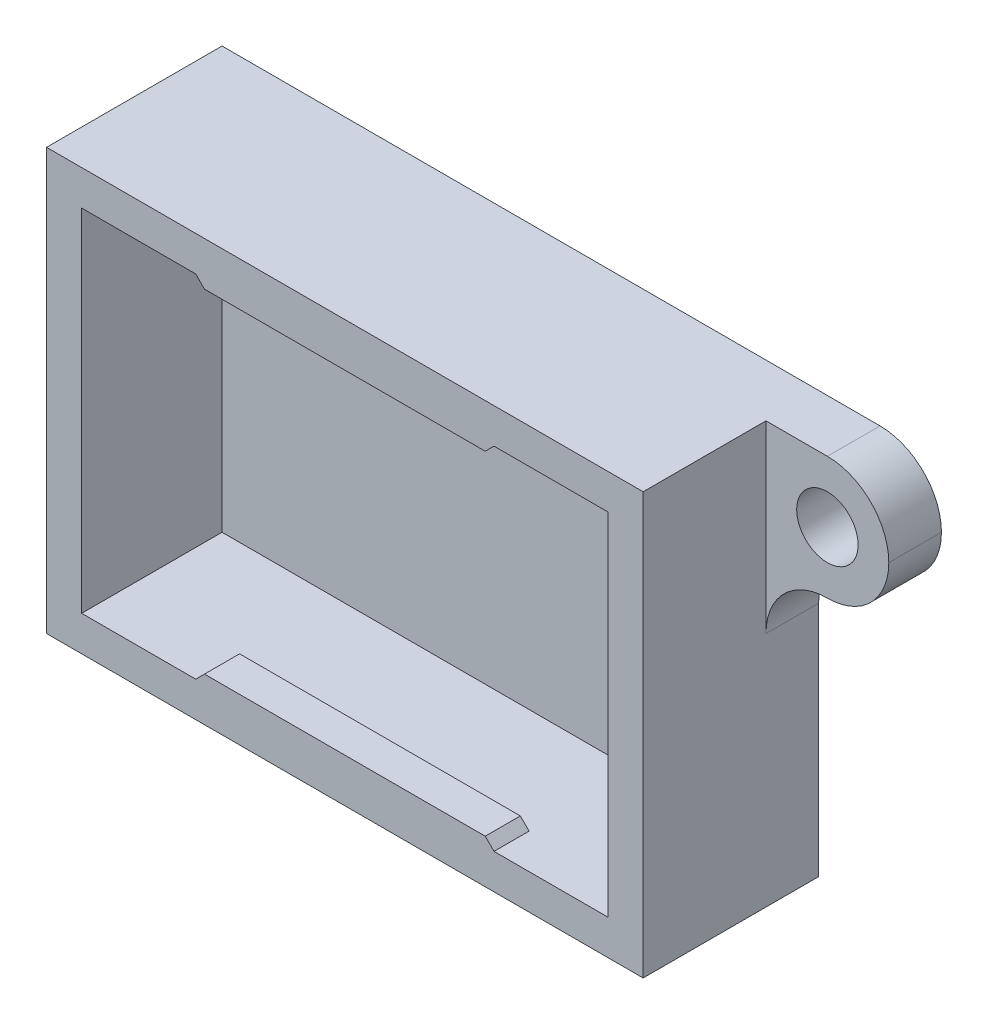
ISO-10303-21;
HEADER;
FILE_DESCRIPTION(('STEP AP214'),'2;1');
FILE_NAME('part.step','',(''),(''),'','','');
FILE_SCHEMA(('AUTOMOTIVE_DESIGN { 1 0 10303 214 1 1 1 1 }'));
ENDSEC;
DATA;
#1=APPLICATION_CONTEXT('core data for automotive mechanical design processes');
#2=APPLICATION_PROTOCOL_DEFINITION('international standard','automotive_design',2000,#1);
#3=PRODUCT_CONTEXT('',#1,'mechanical');
#4=PRODUCT('Part','Part','',(#3));
#5=PRODUCT_RELATED_PRODUCT_CATEGORY('part','',(#4));
#6=PRODUCT_DEFINITION_FORMATION('','',#4);
#7=PRODUCT_DEFINITION_CONTEXT('part definition',#1,'design');
#8=PRODUCT_DEFINITION('design','',#6,#7);
#9=PRODUCT_DEFINITION_SHAPE('','',#8);
#10=(LENGTH_UNIT() NAMED_UNIT(*) SI_UNIT(.MILLI.,.METRE.));
#11=(NAMED_UNIT(*) PLANE_ANGLE_UNIT() SI_UNIT($,.RADIAN.));
#12=(NAMED_UNIT(*) SI_UNIT($,.STERADIAN.) SOLID_ANGLE_UNIT());
#13=UNCERTAINTY_MEASURE_WITH_UNIT(LENGTH_MEASURE(1.E-05),#10,'distance_accuracy_value','');
#14=(GEOMETRIC_REPRESENTATION_CONTEXT(3) GLOBAL_UNCERTAINTY_ASSIGNED_CONTEXT((#13)) GLOBAL_UNIT_ASSIGNED_CONTEXT((#10,
#11,#12)) REPRESENTATION_CONTEXT('',''));
#15=CARTESIAN_POINT('',(0.,0.,0.));
#16=DIRECTION('',(0.,0.,1.));
#17=DIRECTION('',(1.,0.,0.));
#18=AXIS2_PLACEMENT_3D('',#15,#16,#17);
#19=CARTESIAN_POINT('',(-17.,-12.,10.));
#20=DIRECTION('',(1.,0.,0.));
#21=DIRECTION('',(0.,0.,-1.));
#22=AXIS2_PLACEMENT_3D('',#19,#20,#21);
#23=PLANE('',#22);
#24=DIRECTION('',(0.,-1.,0.));
#25=VECTOR('',#24,1.);
#26=CARTESIAN_POINT('',(-17.,-12.,0.));
#27=LINE('',#26,#25);
#28=CARTESIAN_POINT('',(-17.,12.,0.));
#29=VERTEX_POINT('',#28);
#30=CARTESIAN_POINT('',(-17.,-1.5,0.));
#31=VERTEX_POINT('',#30);
#32=EDGE_CURVE('E255',#29,#31,#27,.T.);
#33=ORIENTED_EDGE('',*,*,#32,.T.);
#34=DIRECTION('',(0.,0.,-1.));
#35=VECTOR('',#34,1.);
#36=CARTESIAN_POINT('',(-17.,-1.5,3.));
#37=LINE('',#36,#35);
#38=CARTESIAN_POINT('',(-17.,-1.5,3.));
#39=VERTEX_POINT('',#38);
#40=EDGE_CURVE('E396',#31,#39,#37,.F.);
#41=ORIENTED_EDGE('',*,*,#40,.T.);
#42=DIRECTION('',(0.,1.,0.));
#43=VECTOR('',#42,1.);
#44=CARTESIAN_POINT('',(-17.,-12.,3.));
#45=LINE('',#44,#43);
#46=CARTESIAN_POINT('',(-17.,-12.,3.));
#47=VERTEX_POINT('',#46);
#48=EDGE_CURVE('E272',#47,#39,#45,.T.);
#49=ORIENTED_EDGE('',*,*,#48,.F.);
#50=DIRECTION('',(0.,0.,-1.));
#51=VECTOR('',#50,1.);
#52=CARTESIAN_POINT('',(-17.,-12.,10.));
#53=LINE('',#52,#51);
#54=CARTESIAN_POINT('',(-17.,-12.,10.));
#55=VERTEX_POINT('',#54);
#56=EDGE_CURVE('E266',#55,#47,#53,.T.);
#57=ORIENTED_EDGE('',*,*,#56,.F.);
#58=DIRECTION('',(0.,-1.,0.));
#59=VECTOR('',#58,1.);
#60=CARTESIAN_POINT('',(-17.,-12.,10.));
#61=LINE('',#60,#59);
#62=CARTESIAN_POINT('',(-17.,12.,10.));
#63=VERTEX_POINT('',#62);
#64=EDGE_CURVE('E353',#63,#55,#61,.T.);
#65=ORIENTED_EDGE('',*,*,#64,.F.);
#66=DIRECTION('',(0.,0.,-1.));
#67=VECTOR('',#66,1.);
#68=CARTESIAN_POINT('',(-17.,12.,10.));
#69=LINE('',#68,#67);
#70=EDGE_CURVE('E270',#63,#29,#69,.T.);
#71=ORIENTED_EDGE('',*,*,#70,.T.);
#72=EDGE_LOOP('',(#33,#41,#49,#57,#65,#71));
#73=FACE_BOUND('',#72,.T.);
#74=ADVANCED_FACE('F33',(#73),#23,.F.);
#75=CARTESIAN_POINT('',(17.,-12.,10.));
#76=DIRECTION('',(-1.,0.,0.));
#77=DIRECTION('',(0.,0.,1.));
#78=AXIS2_PLACEMENT_3D('',#75,#76,#77);
#79=PLANE('',#78);
#80=DIRECTION('',(0.,1.,0.));
#81=VECTOR('',#80,1.);
#82=CARTESIAN_POINT('',(17.,-12.,0.));
#83=LINE('',#82,#81);
#84=CARTESIAN_POINT('',(17.,-12.,0.));
#85=VERTEX_POINT('',#84);
#86=CARTESIAN_POINT('',(17.,1.5,0.));
#87=VERTEX_POINT('',#86);
#88=EDGE_CURVE('E241',#85,#87,#83,.T.);
#89=ORIENTED_EDGE('',*,*,#88,.T.);
#90=DIRECTION('',(0.,0.,-1.));
#91=VECTOR('',#90,1.);
#92=CARTESIAN_POINT('',(17.,1.5,3.));
#93=LINE('',#92,#91);
#94=CARTESIAN_POINT('',(17.,1.5,3.));
#95=VERTEX_POINT('',#94);
#96=EDGE_CURVE('E406',#87,#95,#93,.F.);
#97=ORIENTED_EDGE('',*,*,#96,.T.);
#98=DIRECTION('',(0.,-1.,0.));
#99=VECTOR('',#98,1.);
#100=CARTESIAN_POINT('',(17.,12.,3.));
#101=LINE('',#100,#99);
#102=CARTESIAN_POINT('',(17.,12.,3.));
#103=VERTEX_POINT('',#102);
#104=EDGE_CURVE('E47',#103,#95,#101,.T.);
#105=ORIENTED_EDGE('',*,*,#104,.F.);
#106=DIRECTION('',(0.,0.,-1.));
#107=VECTOR('',#106,1.);
#108=CARTESIAN_POINT('',(17.,12.,10.));
#109=LINE('',#108,#107);
#110=CARTESIAN_POINT('',(17.,12.,10.));
#111=VERTEX_POINT('',#110);
#112=EDGE_CURVE('E246',#111,#103,#109,.T.);
#113=ORIENTED_EDGE('',*,*,#112,.F.);
#114=DIRECTION('',(0.,1.,0.));
#115=VECTOR('',#114,1.);
#116=CARTESIAN_POINT('',(17.,-12.,10.));
#117=LINE('',#116,#115);
#118=CARTESIAN_POINT('',(17.,-12.,10.));
#119=VERTEX_POINT('',#118);
#120=EDGE_CURVE('E349',#119,#111,#117,.T.);
#121=ORIENTED_EDGE('',*,*,#120,.F.);
#122=DIRECTION('',(0.,0.,-1.));
#123=VECTOR('',#122,1.);
#124=CARTESIAN_POINT('',(17.,-12.,10.));
#125=LINE('',#124,#123);
#126=EDGE_CURVE('E271',#119,#85,#125,.T.);
#127=ORIENTED_EDGE('',*,*,#126,.T.);
#128=EDGE_LOOP('',(#89,#97,#105,#113,#121,#127));
#129=FACE_BOUND('',#128,.T.);
#130=ADVANCED_FACE('F361',(#129),#79,.F.);
#131=CARTESIAN_POINT('',(-15.,10.,2.));
#132=DIRECTION('',(0.,1.,0.));
#133=DIRECTION('',(0.,0.,1.));
#134=AXIS2_PLACEMENT_3D('',#131,#132,#133);
#135=PLANE('',#134);
#136=DIRECTION('',(-1.,0.,0.));
#137=VECTOR('',#136,1.);
#138=CARTESIAN_POINT('',(-15.,10.,10.));
#139=LINE('',#138,#137);
#140=CARTESIAN_POINT('',(15.,10.,10.));
#141=VERTEX_POINT('',#140);
#142=CARTESIAN_POINT('',(8.50000000000001,10.,10.));
#143=VERTEX_POINT('',#142);
#144=EDGE_CURVE('E292',#141,#143,#139,.T.);
#145=ORIENTED_EDGE('',*,*,#144,.T.);
#146=DIRECTION('',(0.,0.,-1.));
#147=VECTOR('',#146,1.);
#148=CARTESIAN_POINT('',(8.50000000000001,10.,8.));
#149=LINE('',#148,#147);
#150=CARTESIAN_POINT('',(8.50000000000001,10.,8.));
#151=VERTEX_POINT('',#150);
#152=EDGE_CURVE('E225',#143,#151,#149,.T.);
#153=ORIENTED_EDGE('',*,*,#152,.T.);
#154=DIRECTION('',(1.,0.,0.));
#155=VECTOR('',#154,1.);
#156=CARTESIAN_POINT('',(-7.99999999999999,10.,8.));
#157=LINE('',#156,#155);
#158=CARTESIAN_POINT('',(-8.49999999999999,10.,8.));
#159=VERTEX_POINT('',#158);
#160=EDGE_CURVE('E290',#159,#151,#157,.T.);
#161=ORIENTED_EDGE('',*,*,#160,.F.);
#162=DIRECTION('',(0.,0.,1.));
#163=VECTOR('',#162,1.);
#164=CARTESIAN_POINT('',(-8.49999999999999,10.,10.));
#165=LINE('',#164,#163);
#166=CARTESIAN_POINT('',(-8.49999999999999,10.,10.));
#167=VERTEX_POINT('',#166);
#168=EDGE_CURVE('E283',#159,#167,#165,.T.);
#169=ORIENTED_EDGE('',*,*,#168,.T.);
#170=CARTESIAN_POINT('',(-15.,10.,10.));
#171=VERTEX_POINT('',#170);
#172=EDGE_CURVE('E334',#167,#171,#139,.T.);
#173=ORIENTED_EDGE('',*,*,#172,.T.);
#174=DIRECTION('',(0.,0.,1.));
#175=VECTOR('',#174,1.);
#176=CARTESIAN_POINT('',(-15.,10.,2.));
#177=LINE('',#176,#175);
#178=CARTESIAN_POINT('',(-15.,10.,2.));
#179=VERTEX_POINT('',#178);
#180=EDGE_CURVE('E345',#179,#171,#177,.T.);
#181=ORIENTED_EDGE('',*,*,#180,.F.);
#182=DIRECTION('',(-1.,0.,0.));
#183=VECTOR('',#182,1.);
#184=CARTESIAN_POINT('',(-15.,10.,2.));
#185=LINE('',#184,#183);
#186=CARTESIAN_POINT('',(15.,10.,2.));
#187=VERTEX_POINT('',#186);
#188=EDGE_CURVE('E322',#187,#179,#185,.T.);
#189=ORIENTED_EDGE('',*,*,#188,.F.);
#190=DIRECTION('',(0.,0.,1.));
#191=VECTOR('',#190,1.);
#192=CARTESIAN_POINT('',(15.,10.,2.));
#193=LINE('',#192,#191);
#194=EDGE_CURVE('E332',#187,#141,#193,.T.);
#195=ORIENTED_EDGE('',*,*,#194,.T.);
#196=EDGE_LOOP('',(#145,#153,#161,#169,#173,#181,#189,#195));
#197=FACE_BOUND('',#196,.T.);
#198=ADVANCED_FACE('F289',(#197),#135,.F.);
#199=CARTESIAN_POINT('',(-17.,12.,10.));
#200=DIRECTION('',(0.,-1.,0.));
#201=DIRECTION('',(0.,0.,-1.));
#202=AXIS2_PLACEMENT_3D('',#199,#200,#201);
#203=PLANE('',#202);
#204=DIRECTION('',(-1.,0.,0.));
#205=VECTOR('',#204,1.);
#206=CARTESIAN_POINT('',(17.,12.,3.));
#207=LINE('',#206,#205);
#208=CARTESIAN_POINT('',(20.5,12.,3.));
#209=VERTEX_POINT('',#208);
#210=EDGE_CURVE('E437',#209,#103,#207,.T.);
#211=ORIENTED_EDGE('',*,*,#210,.F.);
#212=DIRECTION('',(0.,0.,-1.));
#213=VECTOR('',#212,1.);
#214=CARTESIAN_POINT('',(20.5,12.,10.));
#215=LINE('',#214,#213);
#216=CARTESIAN_POINT('',(20.5,12.,0.));
#217=VERTEX_POINT('',#216);
#218=EDGE_CURVE('E240',#209,#217,#215,.T.);
#219=ORIENTED_EDGE('',*,*,#218,.T.);
#220=DIRECTION('',(-1.,0.,0.));
#221=VECTOR('',#220,1.);
#222=CARTESIAN_POINT('',(-17.,12.,0.));
#223=LINE('',#222,#221);
#224=EDGE_CURVE('E244',#217,#29,#223,.T.);
#225=ORIENTED_EDGE('',*,*,#224,.T.);
#226=ORIENTED_EDGE('',*,*,#70,.F.);
#227=DIRECTION('',(-1.,0.,0.));
#228=VECTOR('',#227,1.);
#229=CARTESIAN_POINT('',(-17.,12.,10.));
#230=LINE('',#229,#228);
#231=EDGE_CURVE('E352',#111,#63,#230,.T.);
#232=ORIENTED_EDGE('',*,*,#231,.F.);
#233=ORIENTED_EDGE('',*,*,#112,.T.);
#234=EDGE_LOOP('',(#211,#219,#225,#226,#232,#233));
#235=FACE_BOUND('',#234,.T.);
#236=ADVANCED_FACE('F434',(#235),#203,.F.);
#237=CARTESIAN_POINT('',(-17.,-12.,10.));
#238=DIRECTION('',(0.,1.,0.));
#239=DIRECTION('',(0.,0.,1.));
#240=AXIS2_PLACEMENT_3D('',#237,#238,#239);
#241=PLANE('',#240);
#242=DIRECTION('',(1.,0.,0.));
#243=VECTOR('',#242,1.);
#244=CARTESIAN_POINT('',(-17.,-12.,3.));
#245=LINE('',#244,#243);
#246=CARTESIAN_POINT('',(-20.5,-12.,3.));
#247=VERTEX_POINT('',#246);
#248=EDGE_CURVE('E375',#247,#47,#245,.T.);
#249=ORIENTED_EDGE('',*,*,#248,.F.);
#250=DIRECTION('',(0.,0.,-1.));
#251=VECTOR('',#250,1.);
#252=CARTESIAN_POINT('',(-20.5,-12.,10.));
#253=LINE('',#252,#251);
#254=CARTESIAN_POINT('',(-20.5,-12.,0.));
#255=VERTEX_POINT('',#254);
#256=EDGE_CURVE('E374',#247,#255,#253,.T.);
#257=ORIENTED_EDGE('',*,*,#256,.T.);
#258=DIRECTION('',(1.,0.,0.));
#259=VECTOR('',#258,1.);
#260=CARTESIAN_POINT('',(-17.,-12.,0.));
#261=LINE('',#260,#259);
#262=EDGE_CURVE('E258',#255,#85,#261,.T.);
#263=ORIENTED_EDGE('',*,*,#262,.T.);
#264=ORIENTED_EDGE('',*,*,#126,.F.);
#265=DIRECTION('',(1.,0.,0.));
#266=VECTOR('',#265,1.);
#267=CARTESIAN_POINT('',(-17.,-12.,10.));
#268=LINE('',#267,#266);
#269=EDGE_CURVE('E252',#55,#119,#268,.T.);
#270=ORIENTED_EDGE('',*,*,#269,.F.);
#271=ORIENTED_EDGE('',*,*,#56,.T.);
#272=EDGE_LOOP('',(#249,#257,#263,#264,#270,#271));
#273=FACE_BOUND('',#272,.T.);
#274=ADVANCED_FACE('F372',(#273),#241,.F.);
#275=CARTESIAN_POINT('',(0.,0.,10.));
#276=DIRECTION('',(0.,0.,-1.));
#277=DIRECTION('',(-1.,0.,0.));
#278=AXIS2_PLACEMENT_3D('',#275,#276,#277);
#279=PLANE('',#278);
#280=ORIENTED_EDGE('',*,*,#144,.F.);
#281=DIRECTION('',(0.,1.,0.));
#282=VECTOR('',#281,1.);
#283=CARTESIAN_POINT('',(15.,-10.,10.));
#284=LINE('',#283,#282);
#285=CARTESIAN_POINT('',(15.,-10.,10.));
#286=VERTEX_POINT('',#285);
#287=EDGE_CURVE('E317',#286,#141,#284,.T.);
#288=ORIENTED_EDGE('',*,*,#287,.F.);
#289=DIRECTION('',(1.,0.,0.));
#290=VECTOR('',#289,1.);
#291=CARTESIAN_POINT('',(-15.,-10.,10.));
#292=LINE('',#291,#290);
#293=CARTESIAN_POINT('',(8.50000000000001,-10.,10.));
#294=VERTEX_POINT('',#293);
#295=EDGE_CURVE('E339',#294,#286,#292,.T.);
#296=ORIENTED_EDGE('',*,*,#295,.F.);
#297=DIRECTION('',(-0.707106781186552,0.707106781186543,0.));
#298=VECTOR('',#297,1.);
#299=CARTESIAN_POINT('',(-0.750000000000054,-0.750000000000064,10.));
#300=LINE('',#299,#298);
#301=CARTESIAN_POINT('',(8.00000000000001,-9.5,10.));
#302=VERTEX_POINT('',#301);
#303=EDGE_CURVE('E214',#294,#302,#300,.T.);
#304=ORIENTED_EDGE('',*,*,#303,.T.);
#305=DIRECTION('',(-1.,0.,0.));
#306=VECTOR('',#305,1.);
#307=CARTESIAN_POINT('',(-7.99999999999999,-9.5,10.));
#308=LINE('',#307,#306);
#309=CARTESIAN_POINT('',(-7.99999999999999,-9.5,10.));
#310=VERTEX_POINT('',#309);
#311=EDGE_CURVE('E197',#302,#310,#308,.T.);
#312=ORIENTED_EDGE('',*,*,#311,.T.);
#313=DIRECTION('',(-0.707106781186551,-0.707106781186544,0.));
#314=VECTOR('',#313,1.);
#315=CARTESIAN_POINT('',(0.750000000000044,-0.750000000000052,10.));
#316=LINE('',#315,#314);
#317=CARTESIAN_POINT('',(-8.5,-10.,10.));
#318=VERTEX_POINT('',#317);
#319=EDGE_CURVE('E211',#310,#318,#316,.T.);
#320=ORIENTED_EDGE('',*,*,#319,.T.);
#321=CARTESIAN_POINT('',(-15.,-10.,10.));
#322=VERTEX_POINT('',#321);
#323=EDGE_CURVE('E323',#322,#318,#292,.T.);
#324=ORIENTED_EDGE('',*,*,#323,.F.);
#325=DIRECTION('',(0.,-1.,0.));
#326=VECTOR('',#325,1.);
#327=CARTESIAN_POINT('',(-15.,-10.,10.));
#328=LINE('',#327,#326);
#329=EDGE_CURVE('E336',#171,#322,#328,.T.);
#330=ORIENTED_EDGE('',*,*,#329,.F.);
#331=ORIENTED_EDGE('',*,*,#172,.F.);
#332=DIRECTION('',(-0.707106781186541,0.707106781186554,0.));
#333=VECTOR('',#332,1.);
#334=CARTESIAN_POINT('',(0.749999999999929,0.749999999999916,10.));
#335=LINE('',#334,#333);
#336=CARTESIAN_POINT('',(-7.99999999999999,9.5,10.));
#337=VERTEX_POINT('',#336);
#338=EDGE_CURVE('E238',#167,#337,#335,.F.);
#339=ORIENTED_EDGE('',*,*,#338,.T.);
#340=DIRECTION('',(-1.,0.,0.));
#341=VECTOR('',#340,1.);
#342=CARTESIAN_POINT('',(-7.99999999999999,9.5,10.));
#343=LINE('',#342,#341);
#344=CARTESIAN_POINT('',(8.00000000000001,9.5,10.));
#345=VERTEX_POINT('',#344);
#346=EDGE_CURVE('E311',#345,#337,#343,.T.);
#347=ORIENTED_EDGE('',*,*,#346,.F.);
#348=DIRECTION('',(-0.707106781186543,-0.707106781186552,0.));
#349=VECTOR('',#348,1.);
#350=CARTESIAN_POINT('',(-0.749999999999938,0.749999999999927,10.));
#351=LINE('',#350,#349);
#352=EDGE_CURVE('E231',#345,#143,#351,.F.);
#353=ORIENTED_EDGE('',*,*,#352,.T.);
#354=EDGE_LOOP('',(#280,#288,#296,#304,#312,#320,#324,#330,#331,#339,#347,#353));
#355=FACE_BOUND('',#354,.T.);
#356=ORIENTED_EDGE('',*,*,#120,.T.);
#357=ORIENTED_EDGE('',*,*,#231,.T.);
#358=ORIENTED_EDGE('',*,*,#64,.T.);
#359=ORIENTED_EDGE('',*,*,#269,.T.);
#360=EDGE_LOOP('',(#356,#357,#358,#359));
#361=FACE_BOUND('',#360,.T.);
#362=ADVANCED_FACE('F208',(#355,#361),#279,.F.);
#363=CARTESIAN_POINT('',(0.,0.,0.));
#364=DIRECTION('',(0.,0.,-1.));
#365=DIRECTION('',(-1.,0.,0.));
#366=AXIS2_PLACEMENT_3D('',#363,#364,#365);
#367=PLANE('',#366);
#368=CARTESIAN_POINT('',(-20.5,-8.5,0.));
#369=DIRECTION('',(0.,0.,-1.));
#370=DIRECTION('',(1.,0.,0.));
#371=AXIS2_PLACEMENT_3D('',#368,#369,#370);
#372=CIRCLE('',#371,1.75);
#373=CARTESIAN_POINT('',(-18.75,-8.5,0.));
#374=VERTEX_POINT('',#373);
#375=EDGE_CURVE('E403',#374,#374,#372,.T.);
#376=ORIENTED_EDGE('',*,*,#375,.F.);
#377=EDGE_LOOP('',(#376));
#378=FACE_BOUND('',#377,.T.);
#379=CARTESIAN_POINT('',(20.5,8.5,0.));
#380=DIRECTION('',(0.,0.,-1.));
#381=DIRECTION('',(-1.,0.,0.));
#382=AXIS2_PLACEMENT_3D('',#379,#380,#381);
#383=CIRCLE('',#382,1.75);
#384=CARTESIAN_POINT('',(18.75,8.5,0.));
#385=VERTEX_POINT('',#384);
#386=EDGE_CURVE('E425',#385,#385,#383,.T.);
#387=ORIENTED_EDGE('',*,*,#386,.F.);
#388=EDGE_LOOP('',(#387));
#389=FACE_BOUND('',#388,.T.);
#390=ORIENTED_EDGE('',*,*,#262,.F.);
#391=CARTESIAN_POINT('',(-20.5,-8.5,0.));
#392=DIRECTION('',(0.,0.,-1.));
#393=DIRECTION('',(-1.,0.,0.));
#394=AXIS2_PLACEMENT_3D('',#391,#392,#393);
#395=CIRCLE('',#394,3.5);
#396=CARTESIAN_POINT('',(-24.,-8.5,0.));
#397=VERTEX_POINT('',#396);
#398=EDGE_CURVE('E368',#255,#397,#395,.T.);
#399=ORIENTED_EDGE('',*,*,#398,.T.);
#400=CARTESIAN_POINT('',(-20.5,-8.5,0.));
#401=DIRECTION('',(0.,0.,-1.));
#402=DIRECTION('',(-1.,0.,0.));
#403=AXIS2_PLACEMENT_3D('',#400,#401,#402);
#404=CIRCLE('',#403,3.5);
#405=CARTESIAN_POINT('',(-20.5,-5.,0.));
#406=VERTEX_POINT('',#405);
#407=EDGE_CURVE('E378',#397,#406,#404,.T.);
#408=ORIENTED_EDGE('',*,*,#407,.T.);
#409=CARTESIAN_POINT('',(-20.5,-1.5,0.));
#410=DIRECTION('',(0.,0.,-1.));
#411=DIRECTION('',(-1.,0.,0.));
#412=AXIS2_PLACEMENT_3D('',#409,#410,#411);
#413=CIRCLE('',#412,3.5);
#414=EDGE_CURVE('E408',#406,#31,#413,.F.);
#415=ORIENTED_EDGE('',*,*,#414,.T.);
#416=ORIENTED_EDGE('',*,*,#32,.F.);
#417=ORIENTED_EDGE('',*,*,#224,.F.);
#418=CARTESIAN_POINT('',(20.5,8.5,0.));
#419=DIRECTION('',(0.,0.,-1.));
#420=DIRECTION('',(-1.,0.,0.));
#421=AXIS2_PLACEMENT_3D('',#418,#419,#420);
#422=CIRCLE('',#421,3.5);
#423=CARTESIAN_POINT('',(24.,8.5,0.));
#424=VERTEX_POINT('',#423);
#425=EDGE_CURVE('E429',#217,#424,#422,.T.);
#426=ORIENTED_EDGE('',*,*,#425,.T.);
#427=CARTESIAN_POINT('',(20.5,8.5,0.));
#428=DIRECTION('',(0.,0.,-1.));
#429=DIRECTION('',(-1.,0.,0.));
#430=AXIS2_PLACEMENT_3D('',#427,#428,#429);
#431=CIRCLE('',#430,3.5);
#432=CARTESIAN_POINT('',(20.5,5.,0.));
#433=VERTEX_POINT('',#432);
#434=EDGE_CURVE('E440',#424,#433,#431,.T.);
#435=ORIENTED_EDGE('',*,*,#434,.T.);
#436=CARTESIAN_POINT('',(20.5,1.5,0.));
#437=DIRECTION('',(0.,0.,-1.));
#438=DIRECTION('',(-1.,0.,0.));
#439=AXIS2_PLACEMENT_3D('',#436,#437,#438);
#440=CIRCLE('',#439,3.5);
#441=EDGE_CURVE('E41',#433,#87,#440,.F.);
#442=ORIENTED_EDGE('',*,*,#441,.T.);
#443=ORIENTED_EDGE('',*,*,#88,.F.);
#444=EDGE_LOOP('',(#390,#399,#408,#415,#416,#417,#426,#435,#442,#443));
#445=FACE_BOUND('',#444,.T.);
#446=ADVANCED_FACE('F366',(#378,#389,#445),#367,.T.);
#447=CARTESIAN_POINT('',(15.,-10.,2.));
#448=DIRECTION('',(1.,0.,0.));
#449=DIRECTION('',(0.,0.,-1.));
#450=AXIS2_PLACEMENT_3D('',#447,#448,#449);
#451=PLANE('',#450);
#452=ORIENTED_EDGE('',*,*,#287,.T.);
#453=ORIENTED_EDGE('',*,*,#194,.F.);
#454=DIRECTION('',(0.,1.,0.));
#455=VECTOR('',#454,1.);
#456=CARTESIAN_POINT('',(15.,-10.,2.));
#457=LINE('',#456,#455);
#458=CARTESIAN_POINT('',(15.,-10.,2.));
#459=VERTEX_POINT('',#458);
#460=EDGE_CURVE('E319',#459,#187,#457,.T.);
#461=ORIENTED_EDGE('',*,*,#460,.F.);
#462=DIRECTION('',(0.,0.,1.));
#463=VECTOR('',#462,1.);
#464=CARTESIAN_POINT('',(15.,-10.,2.));
#465=LINE('',#464,#463);
#466=EDGE_CURVE('E245',#459,#286,#465,.T.);
#467=ORIENTED_EDGE('',*,*,#466,.T.);
#468=EDGE_LOOP('',(#452,#453,#461,#467));
#469=FACE_BOUND('',#468,.T.);
#470=ADVANCED_FACE('F471',(#469),#451,.F.);
#471=CARTESIAN_POINT('',(-15.,-10.,2.));
#472=DIRECTION('',(0.,-1.,0.));
#473=DIRECTION('',(0.,0.,-1.));
#474=AXIS2_PLACEMENT_3D('',#471,#472,#473);
#475=PLANE('',#474);
#476=ORIENTED_EDGE('',*,*,#323,.T.);
#477=DIRECTION('',(0.,0.,-1.));
#478=VECTOR('',#477,1.);
#479=CARTESIAN_POINT('',(-8.49999999999999,-10.,2.00000000000001));
#480=LINE('',#479,#478);
#481=CARTESIAN_POINT('',(-8.5,-10.,8.));
#482=VERTEX_POINT('',#481);
#483=EDGE_CURVE('E220',#318,#482,#480,.T.);
#484=ORIENTED_EDGE('',*,*,#483,.T.);
#485=DIRECTION('',(1.,0.,0.));
#486=VECTOR('',#485,1.);
#487=CARTESIAN_POINT('',(-7.99999999999999,-10.,8.));
#488=LINE('',#487,#486);
#489=CARTESIAN_POINT('',(8.50000000000001,-10.,8.));
#490=VERTEX_POINT('',#489);
#491=EDGE_CURVE('E204',#482,#490,#488,.T.);
#492=ORIENTED_EDGE('',*,*,#491,.T.);
#493=DIRECTION('',(0.,0.,1.));
#494=VECTOR('',#493,1.);
#495=CARTESIAN_POINT('',(8.50000000000001,-10.,2.));
#496=LINE('',#495,#494);
#497=EDGE_CURVE('E279',#490,#294,#496,.T.);
#498=ORIENTED_EDGE('',*,*,#497,.T.);
#499=ORIENTED_EDGE('',*,*,#295,.T.);
#500=ORIENTED_EDGE('',*,*,#466,.F.);
#501=DIRECTION('',(1.,0.,0.));
#502=VECTOR('',#501,1.);
#503=CARTESIAN_POINT('',(-15.,-10.,2.));
#504=LINE('',#503,#502);
#505=CARTESIAN_POINT('',(-15.,-10.,2.));
#506=VERTEX_POINT('',#505);
#507=EDGE_CURVE('E329',#506,#459,#504,.T.);
#508=ORIENTED_EDGE('',*,*,#507,.F.);
#509=DIRECTION('',(0.,0.,1.));
#510=VECTOR('',#509,1.);
#511=CARTESIAN_POINT('',(-15.,-10.,2.));
#512=LINE('',#511,#510);
#513=EDGE_CURVE('E343',#506,#322,#512,.T.);
#514=ORIENTED_EDGE('',*,*,#513,.T.);
#515=EDGE_LOOP('',(#476,#484,#492,#498,#499,#500,#508,#514));
#516=FACE_BOUND('',#515,.T.);
#517=ADVANCED_FACE('F544',(#516),#475,.F.);
#518=CARTESIAN_POINT('',(-15.,-10.,2.));
#519=DIRECTION('',(-1.,0.,0.));
#520=DIRECTION('',(0.,0.,1.));
#521=AXIS2_PLACEMENT_3D('',#518,#519,#520);
#522=PLANE('',#521);
#523=ORIENTED_EDGE('',*,*,#329,.T.);
#524=ORIENTED_EDGE('',*,*,#513,.F.);
#525=DIRECTION('',(0.,-1.,0.));
#526=VECTOR('',#525,1.);
#527=CARTESIAN_POINT('',(-15.,-10.,2.));
#528=LINE('',#527,#526);
#529=EDGE_CURVE('E326',#179,#506,#528,.T.);
#530=ORIENTED_EDGE('',*,*,#529,.F.);
#531=ORIENTED_EDGE('',*,*,#180,.T.);
#532=EDGE_LOOP('',(#523,#524,#530,#531));
#533=FACE_BOUND('',#532,.T.);
#534=ADVANCED_FACE('F542',(#533),#522,.F.);
#535=CARTESIAN_POINT('',(0.,0.,2.));
#536=DIRECTION('',(0.,0.,-1.));
#537=DIRECTION('',(-1.,0.,0.));
#538=AXIS2_PLACEMENT_3D('',#535,#536,#537);
#539=PLANE('',#538);
#540=ORIENTED_EDGE('',*,*,#460,.T.);
#541=ORIENTED_EDGE('',*,*,#188,.T.);
#542=ORIENTED_EDGE('',*,*,#529,.T.);
#543=ORIENTED_EDGE('',*,*,#507,.T.);
#544=EDGE_LOOP('',(#540,#541,#542,#543));
#545=FACE_BOUND('',#544,.T.);
#546=ADVANCED_FACE('F539',(#545),#539,.F.);
#547=CARTESIAN_POINT('',(-7.99999999999999,9.5,8.));
#548=DIRECTION('',(0.,0.,1.));
#549=DIRECTION('',(1.,0.,0.));
#550=AXIS2_PLACEMENT_3D('',#547,#548,#549);
#551=PLANE('',#550);
#552=ORIENTED_EDGE('',*,*,#160,.T.);
#553=DIRECTION('',(0.707106781186543,0.707106781186552,0.));
#554=VECTOR('',#553,1.);
#555=CARTESIAN_POINT('',(1.23165366794353E-13,1.5,8.));
#556=LINE('',#555,#554);
#557=CARTESIAN_POINT('',(8.00000000000001,9.5,8.));
#558=VERTEX_POINT('',#557);
#559=EDGE_CURVE('E233',#151,#558,#556,.F.);
#560=ORIENTED_EDGE('',*,*,#559,.T.);
#561=DIRECTION('',(1.,0.,0.));
#562=VECTOR('',#561,1.);
#563=CARTESIAN_POINT('',(-7.99999999999999,9.5,8.));
#564=LINE('',#563,#562);
#565=CARTESIAN_POINT('',(-7.99999999999999,9.5,8.));
#566=VERTEX_POINT('',#565);
#567=EDGE_CURVE('E302',#566,#558,#564,.T.);
#568=ORIENTED_EDGE('',*,*,#567,.F.);
#569=DIRECTION('',(0.707106781186541,-0.707106781186554,0.));
#570=VECTOR('',#569,1.);
#571=CARTESIAN_POINT('',(-8.,9.5,8.));
#572=LINE('',#571,#570);
#573=EDGE_CURVE('E235',#566,#159,#572,.F.);
#574=ORIENTED_EDGE('',*,*,#573,.T.);
#575=EDGE_LOOP('',(#552,#560,#568,#574));
#576=FACE_BOUND('',#575,.T.);
#577=ADVANCED_FACE('F301',(#576),#551,.F.);
#578=CARTESIAN_POINT('',(0.,9.5,0.));
#579=DIRECTION('',(0.,-1.,0.));
#580=DIRECTION('',(0.,0.,-1.));
#581=AXIS2_PLACEMENT_3D('',#578,#579,#580);
#582=PLANE('',#581);
#583=DIRECTION('',(0.,0.,-1.));
#584=VECTOR('',#583,1.);
#585=CARTESIAN_POINT('',(-7.99999999999999,9.5,10.));
#586=LINE('',#585,#584);
#587=EDGE_CURVE('E309',#337,#566,#586,.T.);
#588=ORIENTED_EDGE('',*,*,#587,.T.);
#589=ORIENTED_EDGE('',*,*,#567,.T.);
#590=DIRECTION('',(0.,0.,1.));
#591=VECTOR('',#590,1.);
#592=CARTESIAN_POINT('',(8.00000000000001,9.5,10.));
#593=LINE('',#592,#591);
#594=EDGE_CURVE('E297',#558,#345,#593,.T.);
#595=ORIENTED_EDGE('',*,*,#594,.T.);
#596=ORIENTED_EDGE('',*,*,#346,.T.);
#597=EDGE_LOOP('',(#588,#589,#595,#596));
#598=FACE_BOUND('',#597,.T.);
#599=ADVANCED_FACE('F305',(#598),#582,.T.);
#600=CARTESIAN_POINT('',(-7.99999999999999,-9.5,8.));
#601=DIRECTION('',(0.,0.,-1.));
#602=DIRECTION('',(-1.,0.,0.));
#603=AXIS2_PLACEMENT_3D('',#600,#601,#602);
#604=PLANE('',#603);
#605=ORIENTED_EDGE('',*,*,#491,.F.);
#606=DIRECTION('',(0.707106781186551,0.707106781186544,0.));
#607=VECTOR('',#606,1.);
#608=CARTESIAN_POINT('',(-8.49999999999999,-10.,8.));
#609=LINE('',#608,#607);
#610=CARTESIAN_POINT('',(-7.99999999999999,-9.5,8.));
#611=VERTEX_POINT('',#610);
#612=EDGE_CURVE('E221',#482,#611,#609,.T.);
#613=ORIENTED_EDGE('',*,*,#612,.T.);
#614=DIRECTION('',(1.,0.,0.));
#615=VECTOR('',#614,1.);
#616=CARTESIAN_POINT('',(-7.99999999999999,-9.5,8.));
#617=LINE('',#616,#615);
#618=CARTESIAN_POINT('',(8.00000000000001,-9.5,8.));
#619=VERTEX_POINT('',#618);
#620=EDGE_CURVE('E200',#611,#619,#617,.T.);
#621=ORIENTED_EDGE('',*,*,#620,.T.);
#622=DIRECTION('',(0.707106781186552,-0.707106781186543,0.));
#623=VECTOR('',#622,1.);
#624=CARTESIAN_POINT('',(8.50000000000001,-10.,8.));
#625=LINE('',#624,#623);
#626=EDGE_CURVE('E223',#619,#490,#625,.T.);
#627=ORIENTED_EDGE('',*,*,#626,.T.);
#628=EDGE_LOOP('',(#605,#613,#621,#627));
#629=FACE_BOUND('',#628,.T.);
#630=ADVANCED_FACE('F531',(#629),#604,.T.);
#631=CARTESIAN_POINT('',(0.,-9.5,0.));
#632=DIRECTION('',(0.,1.,0.));
#633=DIRECTION('',(0.,0.,-1.));
#634=AXIS2_PLACEMENT_3D('',#631,#632,#633);
#635=PLANE('',#634);
#636=DIRECTION('',(0.,0.,-1.));
#637=VECTOR('',#636,1.);
#638=CARTESIAN_POINT('',(-7.99999999999999,-9.5,10.));
#639=LINE('',#638,#637);
#640=EDGE_CURVE('E194',#310,#611,#639,.T.);
#641=ORIENTED_EDGE('',*,*,#640,.F.);
#642=ORIENTED_EDGE('',*,*,#311,.F.);
#643=DIRECTION('',(0.,0.,1.));
#644=VECTOR('',#643,1.);
#645=CARTESIAN_POINT('',(8.00000000000001,-9.5,10.));
#646=LINE('',#645,#644);
#647=EDGE_CURVE('E215',#619,#302,#646,.T.);
#648=ORIENTED_EDGE('',*,*,#647,.F.);
#649=ORIENTED_EDGE('',*,*,#620,.F.);
#650=EDGE_LOOP('',(#641,#642,#648,#649));
#651=FACE_BOUND('',#650,.T.);
#652=ADVANCED_FACE('F196',(#651),#635,.T.);
#653=CARTESIAN_POINT('',(-8.49999999999999,-10.,2.00000000000001));
#654=DIRECTION('',(0.707106781186544,-0.707106781186551,0.));
#655=DIRECTION('',(0.,0.,-1.));
#656=AXIS2_PLACEMENT_3D('',#653,#654,#655);
#657=PLANE('',#656);
#658=ORIENTED_EDGE('',*,*,#319,.F.);
#659=ORIENTED_EDGE('',*,*,#640,.T.);
#660=ORIENTED_EDGE('',*,*,#612,.F.);
#661=ORIENTED_EDGE('',*,*,#483,.F.);
#662=EDGE_LOOP('',(#658,#659,#660,#661));
#663=FACE_BOUND('',#662,.T.);
#664=ADVANCED_FACE('F218',(#663),#657,.F.);
#665=CARTESIAN_POINT('',(8.50000000000001,-10.,2.));
#666=DIRECTION('',(-0.707106781186542,-0.707106781186552,0.));
#667=DIRECTION('',(0.,0.,1.));
#668=AXIS2_PLACEMENT_3D('',#665,#666,#667);
#669=PLANE('',#668);
#670=ORIENTED_EDGE('',*,*,#626,.F.);
#671=ORIENTED_EDGE('',*,*,#647,.T.);
#672=ORIENTED_EDGE('',*,*,#303,.F.);
#673=ORIENTED_EDGE('',*,*,#497,.F.);
#674=EDGE_LOOP('',(#670,#671,#672,#673));
#675=FACE_BOUND('',#674,.T.);
#676=ADVANCED_FACE('F487',(#675),#669,.F.);
#677=CARTESIAN_POINT('',(8.00000000000001,9.49999999999999,10.));
#678=DIRECTION('',(0.707106781186552,-0.707106781186542,0.));
#679=DIRECTION('',(0.,0.,-1.));
#680=AXIS2_PLACEMENT_3D('',#677,#678,#679);
#681=PLANE('',#680);
#682=ORIENTED_EDGE('',*,*,#559,.F.);
#683=ORIENTED_EDGE('',*,*,#152,.F.);
#684=ORIENTED_EDGE('',*,*,#352,.F.);
#685=ORIENTED_EDGE('',*,*,#594,.F.);
#686=EDGE_LOOP('',(#682,#683,#684,#685));
#687=FACE_BOUND('',#686,.T.);
#688=ADVANCED_FACE('F295',(#687),#681,.T.);
#689=CARTESIAN_POINT('',(-7.99999999999999,9.49999999999999,10.));
#690=DIRECTION('',(-0.707106781186554,-0.707106781186541,0.));
#691=DIRECTION('',(0.,0.,1.));
#692=AXIS2_PLACEMENT_3D('',#689,#690,#691);
#693=PLANE('',#692);
#694=ORIENTED_EDGE('',*,*,#338,.F.);
#695=ORIENTED_EDGE('',*,*,#168,.F.);
#696=ORIENTED_EDGE('',*,*,#573,.F.);
#697=ORIENTED_EDGE('',*,*,#587,.F.);
#698=EDGE_LOOP('',(#694,#695,#696,#697));
#699=FACE_BOUND('',#698,.T.);
#700=ADVANCED_FACE('F493',(#699),#693,.T.);
#701=CARTESIAN_POINT('',(0.,0.,3.));
#702=DIRECTION('',(0.,0.,1.));
#703=DIRECTION('',(1.,0.,0.));
#704=AXIS2_PLACEMENT_3D('',#701,#702,#703);
#705=PLANE('',#704);
#706=CARTESIAN_POINT('',(20.5,8.5,3.));
#707=DIRECTION('',(0.,0.,1.));
#708=DIRECTION('',(1.,0.,0.));
#709=AXIS2_PLACEMENT_3D('',#706,#707,#708);
#710=CIRCLE('',#709,1.75);
#711=CARTESIAN_POINT('',(22.25,8.5,3.));
#712=VERTEX_POINT('',#711);
#713=EDGE_CURVE('E264',#712,#712,#710,.T.);
#714=ORIENTED_EDGE('',*,*,#713,.F.);
#715=EDGE_LOOP('',(#714));
#716=FACE_BOUND('',#715,.T.);
#717=CARTESIAN_POINT('',(20.5,8.5,3.));
#718=DIRECTION('',(0.,0.,1.));
#719=DIRECTION('',(1.,0.,0.));
#720=AXIS2_PLACEMENT_3D('',#717,#718,#719);
#721=CIRCLE('',#720,3.5);
#722=CARTESIAN_POINT('',(20.5,5.,3.));
#723=VERTEX_POINT('',#722);
#724=CARTESIAN_POINT('',(24.,8.5,3.));
#725=VERTEX_POINT('',#724);
#726=EDGE_CURVE('E447',#723,#725,#721,.T.);
#727=ORIENTED_EDGE('',*,*,#726,.T.);
#728=CARTESIAN_POINT('',(20.5,8.5,3.));
#729=DIRECTION('',(0.,0.,1.));
#730=DIRECTION('',(1.,0.,0.));
#731=AXIS2_PLACEMENT_3D('',#728,#729,#730);
#732=CIRCLE('',#731,3.5);
#733=EDGE_CURVE('E383',#725,#209,#732,.T.);
#734=ORIENTED_EDGE('',*,*,#733,.T.);
#735=ORIENTED_EDGE('',*,*,#210,.T.);
#736=ORIENTED_EDGE('',*,*,#104,.T.);
#737=CARTESIAN_POINT('',(20.5,1.5,3.));
#738=DIRECTION('',(0.,0.,1.));
#739=DIRECTION('',(1.,0.,0.));
#740=AXIS2_PLACEMENT_3D('',#737,#738,#739);
#741=CIRCLE('',#740,3.5);
#742=EDGE_CURVE('E11',#95,#723,#741,.F.);
#743=ORIENTED_EDGE('',*,*,#742,.T.);
#744=EDGE_LOOP('',(#727,#734,#735,#736,#743));
#745=FACE_BOUND('',#744,.T.);
#746=ADVANCED_FACE('F463',(#716,#745),#705,.T.);
#747=CARTESIAN_POINT('',(20.5,8.5,3.));
#748=DIRECTION('',(0.,0.,-1.));
#749=DIRECTION('',(-1.,0.,0.));
#750=AXIS2_PLACEMENT_3D('',#747,#748,#749);
#751=CYLINDRICAL_SURFACE('',#750,3.5);
#752=DIRECTION('',(0.,0.,-1.));
#753=VECTOR('',#752,1.);
#754=CARTESIAN_POINT('',(24.,8.5,3.));
#755=LINE('',#754,#753);
#756=EDGE_CURVE('E449',#725,#424,#755,.T.);
#757=ORIENTED_EDGE('',*,*,#756,.F.);
#758=ORIENTED_EDGE('',*,*,#726,.F.);
#759=DIRECTION('',(0.,0.,-1.));
#760=VECTOR('',#759,1.);
#761=CARTESIAN_POINT('',(20.5,5.,3.));
#762=LINE('',#761,#760);
#763=EDGE_CURVE('E379',#433,#723,#762,.F.);
#764=ORIENTED_EDGE('',*,*,#763,.F.);
#765=ORIENTED_EDGE('',*,*,#434,.F.);
#766=EDGE_LOOP('',(#757,#758,#764,#765));
#767=FACE_BOUND('',#766,.T.);
#768=ADVANCED_FACE('F501',(#767),#751,.T.);
#769=CARTESIAN_POINT('',(20.5,8.5,10.));
#770=DIRECTION('',(0.,0.,-1.));
#771=DIRECTION('',(-1.,0.,0.));
#772=AXIS2_PLACEMENT_3D('',#769,#770,#771);
#773=CYLINDRICAL_SURFACE('',#772,3.5);
#774=ORIENTED_EDGE('',*,*,#733,.F.);
#775=ORIENTED_EDGE('',*,*,#756,.T.);
#776=ORIENTED_EDGE('',*,*,#425,.F.);
#777=ORIENTED_EDGE('',*,*,#218,.F.);
#778=EDGE_LOOP('',(#774,#775,#776,#777));
#779=FACE_BOUND('',#778,.T.);
#780=ADVANCED_FACE('F497',(#779),#773,.T.);
#781=CARTESIAN_POINT('',(20.5,8.5,10.000025));
#782=DIRECTION('',(0.,0.,-1.));
#783=DIRECTION('',(-1.,0.,0.));
#784=AXIS2_PLACEMENT_3D('',#781,#782,#783);
#785=CYLINDRICAL_SURFACE('',#784,1.75);
#786=ORIENTED_EDGE('',*,*,#713,.T.);
#787=EDGE_LOOP('',(#786));
#788=FACE_BOUND('',#787,.T.);
#789=ORIENTED_EDGE('',*,*,#386,.T.);
#790=EDGE_LOOP('',(#789));
#791=FACE_BOUND('',#790,.T.);
#792=ADVANCED_FACE('F500',(#788,#791),#785,.F.);
#793=CARTESIAN_POINT('',(0.,0.,3.));
#794=DIRECTION('',(0.,0.,1.));
#795=DIRECTION('',(-1.,0.,0.));
#796=AXIS2_PLACEMENT_3D('',#793,#794,#795);
#797=PLANE('',#796);
#798=CARTESIAN_POINT('',(-20.5,-8.5,3.));
#799=DIRECTION('',(0.,0.,1.));
#800=DIRECTION('',(1.,0.,0.));
#801=AXIS2_PLACEMENT_3D('',#798,#799,#800);
#802=CIRCLE('',#801,1.75);
#803=CARTESIAN_POINT('',(-18.75,-8.5,3.));
#804=VERTEX_POINT('',#803);
#805=EDGE_CURVE('E400',#804,#804,#802,.T.);
#806=ORIENTED_EDGE('',*,*,#805,.F.);
#807=EDGE_LOOP('',(#806));
#808=FACE_BOUND('',#807,.T.);
#809=CARTESIAN_POINT('',(-20.5,-8.5,3.));
#810=DIRECTION('',(0.,0.,1.));
#811=DIRECTION('',(1.,0.,0.));
#812=AXIS2_PLACEMENT_3D('',#809,#810,#811);
#813=CIRCLE('',#812,3.5);
#814=CARTESIAN_POINT('',(-20.5,-5.,3.));
#815=VERTEX_POINT('',#814);
#816=CARTESIAN_POINT('',(-24.,-8.5,3.));
#817=VERTEX_POINT('',#816);
#818=EDGE_CURVE('E389',#815,#817,#813,.T.);
#819=ORIENTED_EDGE('',*,*,#818,.T.);
#820=CARTESIAN_POINT('',(-20.5,-8.5,3.));
#821=DIRECTION('',(0.,0.,1.));
#822=DIRECTION('',(1.,0.,0.));
#823=AXIS2_PLACEMENT_3D('',#820,#821,#822);
#824=CIRCLE('',#823,3.5);
#825=EDGE_CURVE('E391',#817,#247,#824,.T.);
#826=ORIENTED_EDGE('',*,*,#825,.T.);
#827=ORIENTED_EDGE('',*,*,#248,.T.);
#828=ORIENTED_EDGE('',*,*,#48,.T.);
#829=CARTESIAN_POINT('',(-20.5,-1.5,3.));
#830=DIRECTION('',(0.,0.,1.));
#831=DIRECTION('',(1.,0.,0.));
#832=AXIS2_PLACEMENT_3D('',#829,#830,#831);
#833=CIRCLE('',#832,3.5);
#834=EDGE_CURVE('E410',#39,#815,#833,.F.);
#835=ORIENTED_EDGE('',*,*,#834,.T.);
#836=EDGE_LOOP('',(#819,#826,#827,#828,#835));
#837=FACE_BOUND('',#836,.T.);
#838=ADVANCED_FACE('F414',(#808,#837),#797,.T.);
#839=CARTESIAN_POINT('',(-20.5,-8.5,3.));
#840=DIRECTION('',(0.,0.,-1.));
#841=DIRECTION('',(-1.,0.,0.));
#842=AXIS2_PLACEMENT_3D('',#839,#840,#841);
#843=CYLINDRICAL_SURFACE('',#842,3.5);
#844=DIRECTION('',(0.,0.,-1.));
#845=VECTOR('',#844,1.);
#846=CARTESIAN_POINT('',(-24.,-8.5,3.));
#847=LINE('',#846,#845);
#848=EDGE_CURVE('E397',#817,#397,#847,.T.);
#849=ORIENTED_EDGE('',*,*,#848,.F.);
#850=ORIENTED_EDGE('',*,*,#818,.F.);
#851=DIRECTION('',(0.,0.,-1.));
#852=VECTOR('',#851,1.);
#853=CARTESIAN_POINT('',(-20.5,-5.,3.));
#854=LINE('',#853,#852);
#855=EDGE_CURVE('E393',#406,#815,#854,.F.);
#856=ORIENTED_EDGE('',*,*,#855,.F.);
#857=ORIENTED_EDGE('',*,*,#407,.F.);
#858=EDGE_LOOP('',(#849,#850,#856,#857));
#859=FACE_BOUND('',#858,.T.);
#860=ADVANCED_FACE('F421',(#859),#843,.T.);
#861=CARTESIAN_POINT('',(-20.5,-8.5,10.));
#862=DIRECTION('',(0.,0.,-1.));
#863=DIRECTION('',(-1.,0.,0.));
#864=AXIS2_PLACEMENT_3D('',#861,#862,#863);
#865=CYLINDRICAL_SURFACE('',#864,3.5);
#866=ORIENTED_EDGE('',*,*,#825,.F.);
#867=ORIENTED_EDGE('',*,*,#848,.T.);
#868=ORIENTED_EDGE('',*,*,#398,.F.);
#869=ORIENTED_EDGE('',*,*,#256,.F.);
#870=EDGE_LOOP('',(#866,#867,#868,#869));
#871=FACE_BOUND('',#870,.T.);
#872=ADVANCED_FACE('F424',(#871),#865,.T.);
#873=CARTESIAN_POINT('',(-20.5,-8.5,10.000025));
#874=DIRECTION('',(0.,0.,-1.));
#875=DIRECTION('',(-1.,0.,0.));
#876=AXIS2_PLACEMENT_3D('',#873,#874,#875);
#877=CYLINDRICAL_SURFACE('',#876,1.75);
#878=ORIENTED_EDGE('',*,*,#805,.T.);
#879=EDGE_LOOP('',(#878));
#880=FACE_BOUND('',#879,.T.);
#881=ORIENTED_EDGE('',*,*,#375,.T.);
#882=EDGE_LOOP('',(#881));
#883=FACE_BOUND('',#882,.T.);
#884=ADVANCED_FACE('F507',(#880,#883),#877,.F.);
#885=CARTESIAN_POINT('',(-20.5,-1.5,3.));
#886=DIRECTION('',(0.,0.,1.));
#887=DIRECTION('',(1.,0.,0.));
#888=AXIS2_PLACEMENT_3D('',#885,#886,#887);
#889=CYLINDRICAL_SURFACE('',#888,3.5);
#890=ORIENTED_EDGE('',*,*,#834,.F.);
#891=ORIENTED_EDGE('',*,*,#40,.F.);
#892=ORIENTED_EDGE('',*,*,#414,.F.);
#893=ORIENTED_EDGE('',*,*,#855,.T.);
#894=EDGE_LOOP('',(#890,#891,#892,#893));
#895=FACE_BOUND('',#894,.T.);
#896=ADVANCED_FACE('F422',(#895),#889,.F.);
#897=CARTESIAN_POINT('',(20.5,1.5,3.));
#898=DIRECTION('',(0.,0.,1.));
#899=DIRECTION('',(1.,0.,0.));
#900=AXIS2_PLACEMENT_3D('',#897,#898,#899);
#901=CYLINDRICAL_SURFACE('',#900,3.5);
#902=ORIENTED_EDGE('',*,*,#742,.F.);
#903=ORIENTED_EDGE('',*,*,#96,.F.);
#904=ORIENTED_EDGE('',*,*,#441,.F.);
#905=ORIENTED_EDGE('',*,*,#763,.T.);
#906=EDGE_LOOP('',(#902,#903,#904,#905));
#907=FACE_BOUND('',#906,.T.);
#908=ADVANCED_FACE('F35',(#907),#901,.F.);
#909=CLOSED_SHELL('',(#74,#130,#198,#236,#274,#362,#446,#470,#517,#534,#546,#577,#599,#630,#652,
#664,#676,#688,#700,#746,#768,#780,#792,#838,#860,#872,#884,#896,#908));
#910=MANIFOLD_SOLID_BREP('B2',#909);
#911=ADVANCED_BREP_SHAPE_REPRESENTATION('',(#18,#910),#14);
#912=SHAPE_DEFINITION_REPRESENTATION(#9,#911);
ENDSEC;
END-ISO-10303-21;
